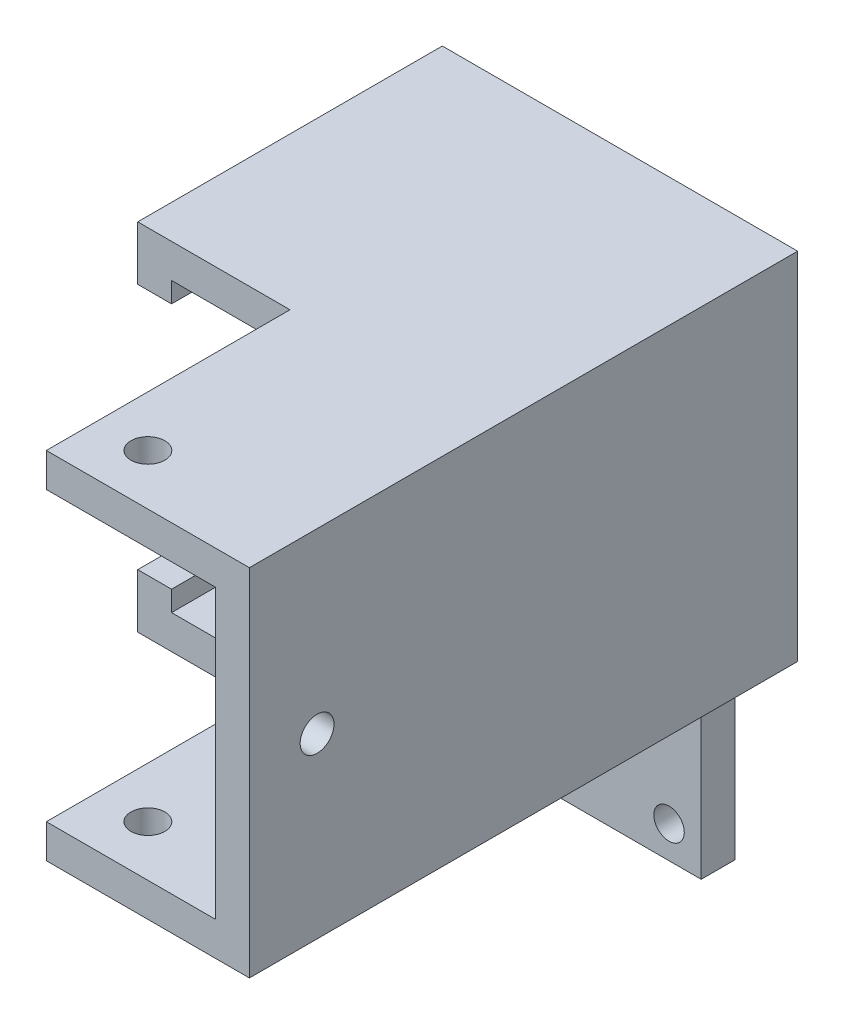
ISO-10303-21;
HEADER;
FILE_DESCRIPTION(('STEP AP214'),'2;1');
FILE_NAME('part.step','',(''),(''),'','','');
FILE_SCHEMA(('AUTOMOTIVE_DESIGN { 1 0 10303 214 1 1 1 1 }'));
ENDSEC;
DATA;
#1=APPLICATION_CONTEXT('core data for automotive mechanical design processes');
#2=APPLICATION_PROTOCOL_DEFINITION('international standard','automotive_design',2000,#1);
#3=PRODUCT_CONTEXT('',#1,'mechanical');
#4=PRODUCT('Part','Part','',(#3));
#5=PRODUCT_RELATED_PRODUCT_CATEGORY('part','',(#4));
#6=PRODUCT_DEFINITION_FORMATION('','',#4);
#7=PRODUCT_DEFINITION_CONTEXT('part definition',#1,'design');
#8=PRODUCT_DEFINITION('design','',#6,#7);
#9=PRODUCT_DEFINITION_SHAPE('','',#8);
#10=(LENGTH_UNIT() NAMED_UNIT(*) SI_UNIT(.MILLI.,.METRE.));
#11=(NAMED_UNIT(*) PLANE_ANGLE_UNIT() SI_UNIT($,.RADIAN.));
#12=(NAMED_UNIT(*) SI_UNIT($,.STERADIAN.) SOLID_ANGLE_UNIT());
#13=UNCERTAINTY_MEASURE_WITH_UNIT(LENGTH_MEASURE(1.E-05),#10,'distance_accuracy_value','');
#14=(GEOMETRIC_REPRESENTATION_CONTEXT(3) GLOBAL_UNCERTAINTY_ASSIGNED_CONTEXT((#13)) GLOBAL_UNIT_ASSIGNED_CONTEXT((#10,
#11,#12)) REPRESENTATION_CONTEXT('',''));
#15=CARTESIAN_POINT('',(0.,0.,0.));
#16=DIRECTION('',(0.,0.,1.));
#17=DIRECTION('',(1.,0.,0.));
#18=AXIS2_PLACEMENT_3D('',#15,#16,#17);
#19=CARTESIAN_POINT('',(0.,0.,45.));
#20=DIRECTION('',(0.,0.,1.));
#21=DIRECTION('',(1.,0.,0.));
#22=AXIS2_PLACEMENT_3D('',#19,#20,#21);
#23=PLANE('',#22);
#24=DIRECTION('',(-1.,0.,0.));
#25=VECTOR('',#24,1.);
#26=CARTESIAN_POINT('',(14.75,38.,45.));
#27=LINE('',#26,#25);
#28=CARTESIAN_POINT('',(-4.24999999999998,38.,45.));
#29=VERTEX_POINT('',#28);
#30=CARTESIAN_POINT('',(-9.24999999999999,38.,45.));
#31=VERTEX_POINT('',#30);
#32=EDGE_CURVE('E374',#29,#31,#27,.T.);
#33=ORIENTED_EDGE('',*,*,#32,.T.);
#34=DIRECTION('',(0.,-1.,0.));
#35=VECTOR('',#34,1.);
#36=CARTESIAN_POINT('',(-9.24999999999999,82.5,45.));
#37=LINE('',#36,#35);
#38=CARTESIAN_POINT('',(-9.24999999999999,30.,45.));
#39=VERTEX_POINT('',#38);
#40=EDGE_CURVE('E202',#31,#39,#37,.T.);
#41=ORIENTED_EDGE('',*,*,#40,.T.);
#42=DIRECTION('',(1.,0.,0.));
#43=VECTOR('',#42,1.);
#44=CARTESIAN_POINT('',(-9.24999999999999,30.,45.));
#45=LINE('',#44,#43);
#46=CARTESIAN_POINT('',(13.25,30.,45.));
#47=VERTEX_POINT('',#46);
#48=EDGE_CURVE('E201',#39,#47,#45,.T.);
#49=ORIENTED_EDGE('',*,*,#48,.T.);
#50=DIRECTION('',(0.,-1.,0.));
#51=VECTOR('',#50,1.);
#52=CARTESIAN_POINT('',(13.25,30.,45.));
#53=LINE('',#52,#51);
#54=CARTESIAN_POINT('',(13.25,35.,45.));
#55=VERTEX_POINT('',#54);
#56=EDGE_CURVE('E62',#55,#47,#53,.T.);
#57=ORIENTED_EDGE('',*,*,#56,.F.);
#58=DIRECTION('',(1.,0.,0.));
#59=VECTOR('',#58,1.);
#60=CARTESIAN_POINT('',(-4.24999999999998,35.,45.));
#61=LINE('',#60,#59);
#62=CARTESIAN_POINT('',(-4.24999999999998,35.,45.));
#63=VERTEX_POINT('',#62);
#64=EDGE_CURVE('E339',#63,#55,#61,.T.);
#65=ORIENTED_EDGE('',*,*,#64,.F.);
#66=DIRECTION('',(0.,-1.,0.));
#67=VECTOR('',#66,1.);
#68=CARTESIAN_POINT('',(-4.24999999999999,77.5,45.));
#69=LINE('',#68,#67);
#70=EDGE_CURVE('E340',#29,#63,#69,.T.);
#71=ORIENTED_EDGE('',*,*,#70,.F.);
#72=EDGE_LOOP('',(#33,#41,#49,#57,#65,#71));
#73=FACE_BOUND('',#72,.T.);
#74=ADVANCED_FACE('F37',(#73),#23,.T.);
#75=CARTESIAN_POINT('',(-4.24999999999999,77.5,45.));
#76=DIRECTION('',(1.,0.,0.));
#77=DIRECTION('',(0.,1.,0.));
#78=AXIS2_PLACEMENT_3D('',#75,#76,#77);
#79=PLANE('',#78);
#80=DIRECTION('',(0.,0.,-1.));
#81=VECTOR('',#80,1.);
#82=CARTESIAN_POINT('',(-4.24999999999998,38.,45.));
#83=LINE('',#82,#81);
#84=CARTESIAN_POINT('',(-4.24999999999999,38.,5.));
#85=VERTEX_POINT('',#84);
#86=EDGE_CURVE('E403',#29,#85,#83,.T.);
#87=ORIENTED_EDGE('',*,*,#86,.F.);
#88=ORIENTED_EDGE('',*,*,#70,.T.);
#89=DIRECTION('',(0.,0.,-1.));
#90=VECTOR('',#89,1.);
#91=CARTESIAN_POINT('',(-4.24999999999998,35.,45.));
#92=LINE('',#91,#90);
#93=CARTESIAN_POINT('',(-4.24999999999998,35.,5.));
#94=VERTEX_POINT('',#93);
#95=EDGE_CURVE('E205',#63,#94,#92,.T.);
#96=ORIENTED_EDGE('',*,*,#95,.T.);
#97=DIRECTION('',(0.,-1.,0.));
#98=VECTOR('',#97,1.);
#99=CARTESIAN_POINT('',(-4.24999999999999,77.5,5.));
#100=LINE('',#99,#98);
#101=EDGE_CURVE('E336',#85,#94,#100,.T.);
#102=ORIENTED_EDGE('',*,*,#101,.F.);
#103=EDGE_LOOP('',(#87,#88,#96,#102));
#104=FACE_BOUND('',#103,.T.);
#105=ADVANCED_FACE('F369',(#104),#79,.T.);
#106=CARTESIAN_POINT('',(0.,0.,5.));
#107=DIRECTION('',(0.,0.,1.));
#108=DIRECTION('',(1.,0.,0.));
#109=AXIS2_PLACEMENT_3D('',#106,#107,#108);
#110=PLANE('',#109);
#111=DIRECTION('',(1.,0.,0.));
#112=VECTOR('',#111,1.);
#113=CARTESIAN_POINT('',(-9.24999999999999,30.,5.));
#114=LINE('',#113,#112);
#115=CARTESIAN_POINT('',(0.,30.,5.));
#116=VERTEX_POINT('',#115);
#117=CARTESIAN_POINT('',(34.,30.,5.));
#118=VERTEX_POINT('',#117);
#119=EDGE_CURVE('E11',#116,#118,#114,.T.);
#120=ORIENTED_EDGE('',*,*,#119,.F.);
#121=DIRECTION('',(0.,-1.,0.));
#122=VECTOR('',#121,1.);
#123=CARTESIAN_POINT('',(0.,0.,5.));
#124=LINE('',#123,#122);
#125=CARTESIAN_POINT('',(0.,0.,5.));
#126=VERTEX_POINT('',#125);
#127=EDGE_CURVE('E235',#116,#126,#124,.T.);
#128=ORIENTED_EDGE('',*,*,#127,.T.);
#129=DIRECTION('',(1.,0.,0.));
#130=VECTOR('',#129,1.);
#131=CARTESIAN_POINT('',(0.,0.,5.));
#132=LINE('',#131,#130);
#133=CARTESIAN_POINT('',(34.,0.,5.));
#134=VERTEX_POINT('',#133);
#135=EDGE_CURVE('E238',#126,#134,#132,.T.);
#136=ORIENTED_EDGE('',*,*,#135,.T.);
#137=DIRECTION('',(0.,1.,0.));
#138=VECTOR('',#137,1.);
#139=CARTESIAN_POINT('',(34.,0.,5.));
#140=LINE('',#139,#138);
#141=EDGE_CURVE('E241',#134,#118,#140,.T.);
#142=ORIENTED_EDGE('',*,*,#141,.T.);
#143=EDGE_LOOP('',(#120,#128,#136,#142));
#144=FACE_BOUND('',#143,.T.);
#145=CARTESIAN_POINT('',(29.25,4.75,5.));
#146=DIRECTION('',(0.,0.,1.));
#147=DIRECTION('',(1.,0.,0.));
#148=AXIS2_PLACEMENT_3D('',#145,#146,#147);
#149=CIRCLE('',#148,2.25);
#150=CARTESIAN_POINT('',(31.5,4.75,5.));
#151=VERTEX_POINT('',#150);
#152=EDGE_CURVE('E217',#151,#151,#149,.T.);
#153=ORIENTED_EDGE('',*,*,#152,.F.);
#154=EDGE_LOOP('',(#153));
#155=FACE_BOUND('',#154,.T.);
#156=CARTESIAN_POINT('',(4.75,25.25,5.));
#157=DIRECTION('',(0.,0.,1.));
#158=DIRECTION('',(1.,0.,0.));
#159=AXIS2_PLACEMENT_3D('',#156,#157,#158);
#160=CIRCLE('',#159,2.25);
#161=CARTESIAN_POINT('',(7.,25.25,5.));
#162=VERTEX_POINT('',#161);
#163=EDGE_CURVE('E229',#162,#162,#160,.T.);
#164=ORIENTED_EDGE('',*,*,#163,.F.);
#165=EDGE_LOOP('',(#164));
#166=FACE_BOUND('',#165,.T.);
#167=CARTESIAN_POINT('',(29.25,25.25,5.));
#168=DIRECTION('',(0.,0.,1.));
#169=DIRECTION('',(1.,0.,0.));
#170=AXIS2_PLACEMENT_3D('',#167,#168,#169);
#171=CIRCLE('',#170,2.25000000000001);
#172=CARTESIAN_POINT('',(31.5,25.25,5.));
#173=VERTEX_POINT('',#172);
#174=EDGE_CURVE('E223',#173,#173,#171,.T.);
#175=ORIENTED_EDGE('',*,*,#174,.F.);
#176=EDGE_LOOP('',(#175));
#177=FACE_BOUND('',#176,.T.);
#178=CARTESIAN_POINT('',(4.75,4.75,5.));
#179=DIRECTION('',(0.,0.,1.));
#180=DIRECTION('',(1.,0.,0.));
#181=AXIS2_PLACEMENT_3D('',#178,#179,#180);
#182=CIRCLE('',#181,2.25);
#183=CARTESIAN_POINT('',(7.,4.75,5.));
#184=VERTEX_POINT('',#183);
#185=EDGE_CURVE('E211',#184,#184,#182,.T.);
#186=ORIENTED_EDGE('',*,*,#185,.F.);
#187=EDGE_LOOP('',(#186));
#188=FACE_BOUND('',#187,.T.);
#189=ADVANCED_FACE('F431',(#144,#155,#166,#177,#188),#110,.T.);
#190=CARTESIAN_POINT('',(0.,0.,0.));
#191=DIRECTION('',(0.,0.,1.));
#192=DIRECTION('',(1.,0.,0.));
#193=AXIS2_PLACEMENT_3D('',#190,#191,#192);
#194=PLANE('',#193);
#195=DIRECTION('',(0.,-1.,0.));
#196=VECTOR('',#195,1.);
#197=CARTESIAN_POINT('',(0.,0.,0.));
#198=LINE('',#197,#196);
#199=CARTESIAN_POINT('',(0.,30.,0.));
#200=VERTEX_POINT('',#199);
#201=CARTESIAN_POINT('',(0.,0.,0.));
#202=VERTEX_POINT('',#201);
#203=EDGE_CURVE('E232',#200,#202,#198,.T.);
#204=ORIENTED_EDGE('',*,*,#203,.F.);
#205=DIRECTION('',(1.,0.,0.));
#206=VECTOR('',#205,1.);
#207=CARTESIAN_POINT('',(0.,30.,0.));
#208=LINE('',#207,#206);
#209=CARTESIAN_POINT('',(-9.24999999999999,30.,0.));
#210=VERTEX_POINT('',#209);
#211=EDGE_CURVE('E239',#210,#200,#208,.T.);
#212=ORIENTED_EDGE('',*,*,#211,.F.);
#213=DIRECTION('',(0.,-1.,0.));
#214=VECTOR('',#213,1.);
#215=CARTESIAN_POINT('',(-9.24999999999999,30.,0.));
#216=LINE('',#215,#214);
#217=CARTESIAN_POINT('',(-9.24999999999999,82.5,0.));
#218=VERTEX_POINT('',#217);
#219=EDGE_CURVE('E256',#218,#210,#216,.T.);
#220=ORIENTED_EDGE('',*,*,#219,.F.);
#221=DIRECTION('',(-1.,0.,0.));
#222=VECTOR('',#221,1.);
#223=CARTESIAN_POINT('',(-9.24999999999999,82.5,0.));
#224=LINE('',#223,#222);
#225=CARTESIAN_POINT('',(43.25,82.5,0.));
#226=VERTEX_POINT('',#225);
#227=EDGE_CURVE('E254',#226,#218,#224,.T.);
#228=ORIENTED_EDGE('',*,*,#227,.F.);
#229=DIRECTION('',(0.,1.,0.));
#230=VECTOR('',#229,1.);
#231=CARTESIAN_POINT('',(43.25,82.5,0.));
#232=LINE('',#231,#230);
#233=CARTESIAN_POINT('',(43.25,30.,0.));
#234=VERTEX_POINT('',#233);
#235=EDGE_CURVE('E252',#234,#226,#232,.T.);
#236=ORIENTED_EDGE('',*,*,#235,.F.);
#237=DIRECTION('',(1.,0.,0.));
#238=VECTOR('',#237,1.);
#239=CARTESIAN_POINT('',(34.,30.,0.));
#240=LINE('',#239,#238);
#241=CARTESIAN_POINT('',(34.,30.,0.));
#242=VERTEX_POINT('',#241);
#243=EDGE_CURVE('E250',#242,#234,#240,.T.);
#244=ORIENTED_EDGE('',*,*,#243,.F.);
#245=DIRECTION('',(0.,1.,0.));
#246=VECTOR('',#245,1.);
#247=CARTESIAN_POINT('',(34.,0.,0.));
#248=LINE('',#247,#246);
#249=CARTESIAN_POINT('',(34.,0.,0.));
#250=VERTEX_POINT('',#249);
#251=EDGE_CURVE('E248',#250,#242,#248,.T.);
#252=ORIENTED_EDGE('',*,*,#251,.F.);
#253=DIRECTION('',(1.,0.,0.));
#254=VECTOR('',#253,1.);
#255=CARTESIAN_POINT('',(0.,0.,0.));
#256=LINE('',#255,#254);
#257=EDGE_CURVE('E246',#202,#250,#256,.T.);
#258=ORIENTED_EDGE('',*,*,#257,.F.);
#259=EDGE_LOOP('',(#204,#212,#220,#228,#236,#244,#252,#258));
#260=FACE_BOUND('',#259,.T.);
#261=CARTESIAN_POINT('',(4.75,25.25,0.));
#262=DIRECTION('',(0.,0.,1.));
#263=DIRECTION('',(1.,0.,0.));
#264=AXIS2_PLACEMENT_3D('',#261,#262,#263);
#265=CIRCLE('',#264,2.25);
#266=CARTESIAN_POINT('',(7.,25.25,0.));
#267=VERTEX_POINT('',#266);
#268=EDGE_CURVE('E226',#267,#267,#265,.T.);
#269=ORIENTED_EDGE('',*,*,#268,.T.);
#270=EDGE_LOOP('',(#269));
#271=FACE_BOUND('',#270,.T.);
#272=CARTESIAN_POINT('',(29.25,25.25,0.));
#273=DIRECTION('',(0.,0.,1.));
#274=DIRECTION('',(1.,0.,0.));
#275=AXIS2_PLACEMENT_3D('',#272,#273,#274);
#276=CIRCLE('',#275,2.25000000000001);
#277=CARTESIAN_POINT('',(31.5,25.25,0.));
#278=VERTEX_POINT('',#277);
#279=EDGE_CURVE('E220',#278,#278,#276,.T.);
#280=ORIENTED_EDGE('',*,*,#279,.T.);
#281=EDGE_LOOP('',(#280));
#282=FACE_BOUND('',#281,.T.);
#283=CARTESIAN_POINT('',(29.25,4.75,0.));
#284=DIRECTION('',(0.,0.,1.));
#285=DIRECTION('',(1.,0.,0.));
#286=AXIS2_PLACEMENT_3D('',#283,#284,#285);
#287=CIRCLE('',#286,2.25);
#288=CARTESIAN_POINT('',(31.5,4.75,0.));
#289=VERTEX_POINT('',#288);
#290=EDGE_CURVE('E214',#289,#289,#287,.T.);
#291=ORIENTED_EDGE('',*,*,#290,.T.);
#292=EDGE_LOOP('',(#291));
#293=FACE_BOUND('',#292,.T.);
#294=CARTESIAN_POINT('',(4.75,4.75,0.));
#295=DIRECTION('',(0.,0.,1.));
#296=DIRECTION('',(1.,0.,0.));
#297=AXIS2_PLACEMENT_3D('',#294,#295,#296);
#298=CIRCLE('',#297,2.25);
#299=CARTESIAN_POINT('',(7.,4.75,0.));
#300=VERTEX_POINT('',#299);
#301=EDGE_CURVE('E209',#300,#300,#298,.T.);
#302=ORIENTED_EDGE('',*,*,#301,.T.);
#303=EDGE_LOOP('',(#302));
#304=FACE_BOUND('',#303,.T.);
#305=ADVANCED_FACE('F424',(#260,#271,#282,#293,#304),#194,.F.);
#306=CARTESIAN_POINT('',(0.,0.,5.));
#307=DIRECTION('',(1.,0.,0.));
#308=DIRECTION('',(0.,1.,0.));
#309=AXIS2_PLACEMENT_3D('',#306,#307,#308);
#310=PLANE('',#309);
#311=ORIENTED_EDGE('',*,*,#203,.T.);
#312=DIRECTION('',(0.,0.,-1.));
#313=VECTOR('',#312,1.);
#314=CARTESIAN_POINT('',(0.,0.,5.));
#315=LINE('',#314,#313);
#316=EDGE_CURVE('E46',#126,#202,#315,.T.);
#317=ORIENTED_EDGE('',*,*,#316,.F.);
#318=ORIENTED_EDGE('',*,*,#127,.F.);
#319=DIRECTION('',(0.,0.,-1.));
#320=VECTOR('',#319,1.);
#321=CARTESIAN_POINT('',(0.,30.,5.));
#322=LINE('',#321,#320);
#323=EDGE_CURVE('E243',#116,#200,#322,.T.);
#324=ORIENTED_EDGE('',*,*,#323,.T.);
#325=EDGE_LOOP('',(#311,#317,#318,#324));
#326=FACE_BOUND('',#325,.T.);
#327=ADVANCED_FACE('F39',(#326),#310,.F.);
#328=CARTESIAN_POINT('',(0.,0.,5.));
#329=DIRECTION('',(0.,1.,0.));
#330=DIRECTION('',(0.,0.,1.));
#331=AXIS2_PLACEMENT_3D('',#328,#329,#330);
#332=PLANE('',#331);
#333=ORIENTED_EDGE('',*,*,#257,.T.);
#334=DIRECTION('',(0.,0.,-1.));
#335=VECTOR('',#334,1.);
#336=CARTESIAN_POINT('',(34.,0.,5.));
#337=LINE('',#336,#335);
#338=EDGE_CURVE('E275',#134,#250,#337,.T.);
#339=ORIENTED_EDGE('',*,*,#338,.F.);
#340=ORIENTED_EDGE('',*,*,#135,.F.);
#341=ORIENTED_EDGE('',*,*,#316,.T.);
#342=EDGE_LOOP('',(#333,#339,#340,#341));
#343=FACE_BOUND('',#342,.T.);
#344=ADVANCED_FACE('F439',(#343),#332,.F.);
#345=CARTESIAN_POINT('',(34.,0.,5.));
#346=DIRECTION('',(-1.,0.,0.));
#347=DIRECTION('',(0.,-1.,0.));
#348=AXIS2_PLACEMENT_3D('',#345,#346,#347);
#349=PLANE('',#348);
#350=ORIENTED_EDGE('',*,*,#251,.T.);
#351=DIRECTION('',(0.,0.,-1.));
#352=VECTOR('',#351,1.);
#353=CARTESIAN_POINT('',(34.,30.,5.));
#354=LINE('',#353,#352);
#355=EDGE_CURVE('E272',#118,#242,#354,.T.);
#356=ORIENTED_EDGE('',*,*,#355,.F.);
#357=ORIENTED_EDGE('',*,*,#141,.F.);
#358=ORIENTED_EDGE('',*,*,#338,.T.);
#359=EDGE_LOOP('',(#350,#356,#357,#358));
#360=FACE_BOUND('',#359,.T.);
#361=ADVANCED_FACE('F413',(#360),#349,.F.);
#362=CARTESIAN_POINT('',(43.25,82.5,5.));
#363=DIRECTION('',(-1.,0.,0.));
#364=DIRECTION('',(0.,-1.,0.));
#365=AXIS2_PLACEMENT_3D('',#362,#363,#364);
#366=PLANE('',#365);
#367=CARTESIAN_POINT('',(43.25,56.25,71.));
#368=DIRECTION('',(1.,0.,0.));
#369=DIRECTION('',(0.,1.,0.));
#370=AXIS2_PLACEMENT_3D('',#367,#368,#369);
#371=CIRCLE('',#370,2.50000000000001);
#372=CARTESIAN_POINT('',(43.25,58.75,71.));
#373=VERTEX_POINT('',#372);
#374=EDGE_CURVE('E293',#373,#373,#371,.T.);
#375=ORIENTED_EDGE('',*,*,#374,.F.);
#376=EDGE_LOOP('',(#375));
#377=FACE_BOUND('',#376,.T.);
#378=ORIENTED_EDGE('',*,*,#235,.T.);
#379=DIRECTION('',(0.,0.,-1.));
#380=VECTOR('',#379,1.);
#381=CARTESIAN_POINT('',(43.25,82.5,5.));
#382=LINE('',#381,#380);
#383=CARTESIAN_POINT('',(43.25,82.5,81.));
#384=VERTEX_POINT('',#383);
#385=EDGE_CURVE('E266',#384,#226,#382,.T.);
#386=ORIENTED_EDGE('',*,*,#385,.F.);
#387=DIRECTION('',(0.,1.,0.));
#388=VECTOR('',#387,1.);
#389=CARTESIAN_POINT('',(43.25,82.5,81.));
#390=LINE('',#389,#388);
#391=CARTESIAN_POINT('',(43.25,30.,81.));
#392=VERTEX_POINT('',#391);
#393=EDGE_CURVE('E318',#392,#384,#390,.T.);
#394=ORIENTED_EDGE('',*,*,#393,.F.);
#395=DIRECTION('',(0.,0.,-1.));
#396=VECTOR('',#395,1.);
#397=CARTESIAN_POINT('',(43.25,30.,5.));
#398=LINE('',#397,#396);
#399=EDGE_CURVE('E269',#392,#234,#398,.T.);
#400=ORIENTED_EDGE('',*,*,#399,.T.);
#401=EDGE_LOOP('',(#378,#386,#394,#400));
#402=FACE_BOUND('',#401,.T.);
#403=ADVANCED_FACE('F409',(#377,#402),#366,.F.);
#404=CARTESIAN_POINT('',(-9.24999999999999,82.5,5.));
#405=DIRECTION('',(0.,-1.,0.));
#406=DIRECTION('',(0.,0.,-1.));
#407=AXIS2_PLACEMENT_3D('',#404,#405,#406);
#408=PLANE('',#407);
#409=CARTESIAN_POINT('',(20.75,82.5,73.5));
#410=DIRECTION('',(0.,-1.,0.));
#411=DIRECTION('',(0.,0.,-1.));
#412=AXIS2_PLACEMENT_3D('',#409,#410,#411);
#413=CIRCLE('',#412,2.5);
#414=CARTESIAN_POINT('',(20.75,82.5,71.));
#415=VERTEX_POINT('',#414);
#416=EDGE_CURVE('E282',#415,#415,#413,.T.);
#417=ORIENTED_EDGE('',*,*,#416,.T.);
#418=EDGE_LOOP('',(#417));
#419=FACE_BOUND('',#418,.T.);
#420=ORIENTED_EDGE('',*,*,#227,.T.);
#421=DIRECTION('',(0.,0.,-1.));
#422=VECTOR('',#421,1.);
#423=CARTESIAN_POINT('',(-9.24999999999999,82.5,5.));
#424=LINE('',#423,#422);
#425=CARTESIAN_POINT('',(-9.24999999999999,82.5,45.));
#426=VERTEX_POINT('',#425);
#427=EDGE_CURVE('E264',#426,#218,#424,.T.);
#428=ORIENTED_EDGE('',*,*,#427,.F.);
#429=DIRECTION('',(-1.,0.,0.));
#430=VECTOR('',#429,1.);
#431=CARTESIAN_POINT('',(-9.24999999999999,82.5,45.));
#432=LINE('',#431,#430);
#433=CARTESIAN_POINT('',(13.25,82.5,45.));
#434=VERTEX_POINT('',#433);
#435=EDGE_CURVE('E199',#434,#426,#432,.T.);
#436=ORIENTED_EDGE('',*,*,#435,.F.);
#437=DIRECTION('',(0.,0.,-1.));
#438=VECTOR('',#437,1.);
#439=CARTESIAN_POINT('',(13.25,82.5,81.));
#440=LINE('',#439,#438);
#441=CARTESIAN_POINT('',(13.25,82.5,81.));
#442=VERTEX_POINT('',#441);
#443=EDGE_CURVE('E333',#442,#434,#440,.T.);
#444=ORIENTED_EDGE('',*,*,#443,.F.);
#445=DIRECTION('',(-1.,0.,0.));
#446=VECTOR('',#445,1.);
#447=CARTESIAN_POINT('',(13.25,82.5,81.));
#448=LINE('',#447,#446);
#449=EDGE_CURVE('E300',#384,#442,#448,.T.);
#450=ORIENTED_EDGE('',*,*,#449,.F.);
#451=ORIENTED_EDGE('',*,*,#385,.T.);
#452=EDGE_LOOP('',(#420,#428,#436,#444,#450,#451));
#453=FACE_BOUND('',#452,.T.);
#454=ADVANCED_FACE('F412',(#419,#453),#408,.F.);
#455=CARTESIAN_POINT('',(-9.24999999999999,30.,5.));
#456=DIRECTION('',(1.,0.,0.));
#457=DIRECTION('',(0.,1.,0.));
#458=AXIS2_PLACEMENT_3D('',#455,#456,#457);
#459=PLANE('',#458);
#460=ORIENTED_EDGE('',*,*,#40,.F.);
#461=DIRECTION('',(0.,0.,1.));
#462=VECTOR('',#461,1.);
#463=CARTESIAN_POINT('',(-9.24999999999999,38.,45.));
#464=LINE('',#463,#462);
#465=CARTESIAN_POINT('',(-9.24999999999999,38.,5.));
#466=VERTEX_POINT('',#465);
#467=EDGE_CURVE('E185',#466,#31,#464,.T.);
#468=ORIENTED_EDGE('',*,*,#467,.F.);
#469=DIRECTION('',(0.,-1.,0.));
#470=VECTOR('',#469,1.);
#471=CARTESIAN_POINT('',(-9.24999999999999,74.5,5.));
#472=LINE('',#471,#470);
#473=CARTESIAN_POINT('',(-9.24999999999999,74.5,5.));
#474=VERTEX_POINT('',#473);
#475=EDGE_CURVE('E195',#474,#466,#472,.T.);
#476=ORIENTED_EDGE('',*,*,#475,.F.);
#477=DIRECTION('',(0.,0.,-1.));
#478=VECTOR('',#477,1.);
#479=CARTESIAN_POINT('',(-9.24999999999999,74.5,45.));
#480=LINE('',#479,#478);
#481=CARTESIAN_POINT('',(-9.24999999999999,74.5,45.));
#482=VERTEX_POINT('',#481);
#483=EDGE_CURVE('E178',#482,#474,#480,.T.);
#484=ORIENTED_EDGE('',*,*,#483,.F.);
#485=EDGE_CURVE('E192',#426,#482,#37,.T.);
#486=ORIENTED_EDGE('',*,*,#485,.F.);
#487=ORIENTED_EDGE('',*,*,#427,.T.);
#488=ORIENTED_EDGE('',*,*,#219,.T.);
#489=DIRECTION('',(0.,0.,-1.));
#490=VECTOR('',#489,1.);
#491=CARTESIAN_POINT('',(-9.24999999999999,30.,5.));
#492=LINE('',#491,#490);
#493=EDGE_CURVE('E261',#39,#210,#492,.T.);
#494=ORIENTED_EDGE('',*,*,#493,.F.);
#495=EDGE_LOOP('',(#460,#468,#476,#484,#486,#487,#488,#494));
#496=FACE_BOUND('',#495,.T.);
#497=ADVANCED_FACE('F190',(#496),#459,.F.);
#498=CARTESIAN_POINT('',(0.,30.,5.));
#499=DIRECTION('',(0.,1.,0.));
#500=DIRECTION('',(0.,0.,1.));
#501=AXIS2_PLACEMENT_3D('',#498,#499,#500);
#502=PLANE('',#501);
#503=CARTESIAN_POINT('',(20.75,30.,73.5));
#504=DIRECTION('',(0.,1.,0.));
#505=DIRECTION('',(0.,0.,1.));
#506=AXIS2_PLACEMENT_3D('',#503,#504,#505);
#507=CIRCLE('',#506,2.5);
#508=CARTESIAN_POINT('',(20.75,30.,76.));
#509=VERTEX_POINT('',#508);
#510=EDGE_CURVE('E286',#509,#509,#507,.T.);
#511=ORIENTED_EDGE('',*,*,#510,.T.);
#512=EDGE_LOOP('',(#511));
#513=FACE_BOUND('',#512,.T.);
#514=ORIENTED_EDGE('',*,*,#211,.T.);
#515=ORIENTED_EDGE('',*,*,#323,.F.);
#516=ORIENTED_EDGE('',*,*,#119,.T.);
#517=ORIENTED_EDGE('',*,*,#355,.T.);
#518=ORIENTED_EDGE('',*,*,#243,.T.);
#519=ORIENTED_EDGE('',*,*,#399,.F.);
#520=DIRECTION('',(1.,0.,0.));
#521=VECTOR('',#520,1.);
#522=CARTESIAN_POINT('',(43.25,30.,81.));
#523=LINE('',#522,#521);
#524=CARTESIAN_POINT('',(13.25,30.,81.));
#525=VERTEX_POINT('',#524);
#526=EDGE_CURVE('E315',#525,#392,#523,.T.);
#527=ORIENTED_EDGE('',*,*,#526,.F.);
#528=DIRECTION('',(0.,0.,-1.));
#529=VECTOR('',#528,1.);
#530=CARTESIAN_POINT('',(13.25,30.,81.));
#531=LINE('',#530,#529);
#532=EDGE_CURVE('E321',#525,#47,#531,.T.);
#533=ORIENTED_EDGE('',*,*,#532,.T.);
#534=ORIENTED_EDGE('',*,*,#48,.F.);
#535=ORIENTED_EDGE('',*,*,#493,.T.);
#536=EDGE_LOOP('',(#514,#515,#516,#517,#518,#519,#527,#533,#534,#535));
#537=FACE_BOUND('',#536,.T.);
#538=ADVANCED_FACE('F383',(#513,#537),#502,.F.);
#539=CARTESIAN_POINT('',(4.75,25.25,5.));
#540=DIRECTION('',(0.,0.,-1.));
#541=DIRECTION('',(-1.,0.,0.));
#542=AXIS2_PLACEMENT_3D('',#539,#540,#541);
#543=CYLINDRICAL_SURFACE('',#542,2.25);
#544=ORIENTED_EDGE('',*,*,#163,.T.);
#545=EDGE_LOOP('',(#544));
#546=FACE_BOUND('',#545,.T.);
#547=ORIENTED_EDGE('',*,*,#268,.F.);
#548=EDGE_LOOP('',(#547));
#549=FACE_BOUND('',#548,.T.);
#550=ADVANCED_FACE('F473',(#546,#549),#543,.F.);
#551=CARTESIAN_POINT('',(29.25,25.25,5.));
#552=DIRECTION('',(0.,0.,-1.));
#553=DIRECTION('',(-1.,0.,0.));
#554=AXIS2_PLACEMENT_3D('',#551,#552,#553);
#555=CYLINDRICAL_SURFACE('',#554,2.25000000000001);
#556=ORIENTED_EDGE('',*,*,#174,.T.);
#557=EDGE_LOOP('',(#556));
#558=FACE_BOUND('',#557,.T.);
#559=ORIENTED_EDGE('',*,*,#279,.F.);
#560=EDGE_LOOP('',(#559));
#561=FACE_BOUND('',#560,.T.);
#562=ADVANCED_FACE('F466',(#558,#561),#555,.F.);
#563=CARTESIAN_POINT('',(29.25,4.75,5.));
#564=DIRECTION('',(0.,0.,-1.));
#565=DIRECTION('',(-1.,0.,0.));
#566=AXIS2_PLACEMENT_3D('',#563,#564,#565);
#567=CYLINDRICAL_SURFACE('',#566,2.25);
#568=ORIENTED_EDGE('',*,*,#152,.T.);
#569=EDGE_LOOP('',(#568));
#570=FACE_BOUND('',#569,.T.);
#571=ORIENTED_EDGE('',*,*,#290,.F.);
#572=EDGE_LOOP('',(#571));
#573=FACE_BOUND('',#572,.T.);
#574=ADVANCED_FACE('F461',(#570,#573),#567,.F.);
#575=CARTESIAN_POINT('',(4.75,4.75,5.));
#576=DIRECTION('',(0.,0.,-1.));
#577=DIRECTION('',(-1.,0.,0.));
#578=AXIS2_PLACEMENT_3D('',#575,#576,#577);
#579=CYLINDRICAL_SURFACE('',#578,2.25);
#580=ORIENTED_EDGE('',*,*,#185,.T.);
#581=EDGE_LOOP('',(#580));
#582=FACE_BOUND('',#581,.T.);
#583=ORIENTED_EDGE('',*,*,#301,.F.);
#584=EDGE_LOOP('',(#583));
#585=FACE_BOUND('',#584,.T.);
#586=ADVANCED_FACE('F455',(#582,#585),#579,.F.);
#587=DIRECTION('',(-1.,0.,0.));
#588=VECTOR('',#587,1.);
#589=CARTESIAN_POINT('',(14.75,74.5,45.));
#590=LINE('',#589,#588);
#591=CARTESIAN_POINT('',(-4.24999999999999,74.5,45.));
#592=VERTEX_POINT('',#591);
#593=EDGE_CURVE('E175',#592,#482,#590,.T.);
#594=ORIENTED_EDGE('',*,*,#593,.F.);
#595=CARTESIAN_POINT('',(-4.24999999999999,77.5,45.));
#596=VERTEX_POINT('',#595);
#597=EDGE_CURVE('E337',#596,#592,#69,.T.);
#598=ORIENTED_EDGE('',*,*,#597,.F.);
#599=DIRECTION('',(-1.,0.,0.));
#600=VECTOR('',#599,1.);
#601=CARTESIAN_POINT('',(-4.24999999999999,77.5,45.));
#602=LINE('',#601,#600);
#603=CARTESIAN_POINT('',(13.25,77.5,45.));
#604=VERTEX_POINT('',#603);
#605=EDGE_CURVE('E342',#604,#596,#602,.T.);
#606=ORIENTED_EDGE('',*,*,#605,.F.);
#607=DIRECTION('',(0.,-1.,0.));
#608=VECTOR('',#607,1.);
#609=CARTESIAN_POINT('',(13.25,82.5,45.));
#610=LINE('',#609,#608);
#611=EDGE_CURVE('E299',#434,#604,#610,.T.);
#612=ORIENTED_EDGE('',*,*,#611,.F.);
#613=ORIENTED_EDGE('',*,*,#435,.T.);
#614=ORIENTED_EDGE('',*,*,#485,.T.);
#615=EDGE_LOOP('',(#594,#598,#606,#612,#613,#614));
#616=FACE_BOUND('',#615,.T.);
#617=ADVANCED_FACE('F197',(#616),#23,.T.);
#618=DIRECTION('',(0.,0.,1.));
#619=VECTOR('',#618,1.);
#620=CARTESIAN_POINT('',(-4.24999999999999,74.5,45.));
#621=LINE('',#620,#619);
#622=CARTESIAN_POINT('',(-4.24999999999999,74.5,5.));
#623=VERTEX_POINT('',#622);
#624=EDGE_CURVE('E180',#623,#592,#621,.T.);
#625=ORIENTED_EDGE('',*,*,#624,.F.);
#626=CARTESIAN_POINT('',(-4.24999999999999,77.5,5.));
#627=VERTEX_POINT('',#626);
#628=EDGE_CURVE('E345',#627,#623,#100,.T.);
#629=ORIENTED_EDGE('',*,*,#628,.F.);
#630=DIRECTION('',(0.,0.,-1.));
#631=VECTOR('',#630,1.);
#632=CARTESIAN_POINT('',(-4.24999999999999,77.5,45.));
#633=LINE('',#632,#631);
#634=EDGE_CURVE('E344',#596,#627,#633,.T.);
#635=ORIENTED_EDGE('',*,*,#634,.F.);
#636=ORIENTED_EDGE('',*,*,#597,.T.);
#637=EDGE_LOOP('',(#625,#629,#635,#636));
#638=FACE_BOUND('',#637,.T.);
#639=ADVANCED_FACE('F452',(#638),#79,.T.);
#640=CARTESIAN_POINT('',(-4.24999999999998,35.,45.));
#641=DIRECTION('',(0.,1.,0.));
#642=DIRECTION('',(0.,0.,1.));
#643=AXIS2_PLACEMENT_3D('',#640,#641,#642);
#644=PLANE('',#643);
#645=CARTESIAN_POINT('',(20.75,35.,73.5));
#646=DIRECTION('',(0.,1.,0.));
#647=DIRECTION('',(0.,0.,1.));
#648=AXIS2_PLACEMENT_3D('',#645,#646,#647);
#649=CIRCLE('',#648,2.5);
#650=CARTESIAN_POINT('',(20.75,35.,76.));
#651=VERTEX_POINT('',#650);
#652=EDGE_CURVE('E281',#651,#651,#649,.T.);
#653=ORIENTED_EDGE('',*,*,#652,.F.);
#654=EDGE_LOOP('',(#653));
#655=FACE_BOUND('',#654,.T.);
#656=DIRECTION('',(1.,0.,0.));
#657=VECTOR('',#656,1.);
#658=CARTESIAN_POINT('',(-4.24999999999998,35.,5.));
#659=LINE('',#658,#657);
#660=CARTESIAN_POINT('',(38.25,35.,5.));
#661=VERTEX_POINT('',#660);
#662=EDGE_CURVE('E348',#94,#661,#659,.T.);
#663=ORIENTED_EDGE('',*,*,#662,.F.);
#664=ORIENTED_EDGE('',*,*,#95,.F.);
#665=ORIENTED_EDGE('',*,*,#64,.T.);
#666=DIRECTION('',(0.,0.,-1.));
#667=VECTOR('',#666,1.);
#668=CARTESIAN_POINT('',(13.25,35.,81.));
#669=LINE('',#668,#667);
#670=CARTESIAN_POINT('',(13.25,35.,81.));
#671=VERTEX_POINT('',#670);
#672=EDGE_CURVE('E327',#671,#55,#669,.T.);
#673=ORIENTED_EDGE('',*,*,#672,.F.);
#674=DIRECTION('',(-1.,0.,0.));
#675=VECTOR('',#674,1.);
#676=CARTESIAN_POINT('',(13.25,35.,81.));
#677=LINE('',#676,#675);
#678=CARTESIAN_POINT('',(38.25,35.,81.));
#679=VERTEX_POINT('',#678);
#680=EDGE_CURVE('E311',#679,#671,#677,.T.);
#681=ORIENTED_EDGE('',*,*,#680,.F.);
#682=DIRECTION('',(0.,0.,-1.));
#683=VECTOR('',#682,1.);
#684=CARTESIAN_POINT('',(38.25,35.,45.));
#685=LINE('',#684,#683);
#686=EDGE_CURVE('E359',#679,#661,#685,.T.);
#687=ORIENTED_EDGE('',*,*,#686,.T.);
#688=EDGE_LOOP('',(#663,#664,#665,#673,#681,#687));
#689=FACE_BOUND('',#688,.T.);
#690=ADVANCED_FACE('F371',(#655,#689),#644,.T.);
#691=CARTESIAN_POINT('',(38.25,77.5,45.));
#692=DIRECTION('',(-1.,0.,0.));
#693=DIRECTION('',(0.,-1.,0.));
#694=AXIS2_PLACEMENT_3D('',#691,#692,#693);
#695=PLANE('',#694);
#696=CARTESIAN_POINT('',(38.25,56.25,71.));
#697=DIRECTION('',(-1.,0.,0.));
#698=DIRECTION('',(0.,-1.,0.));
#699=AXIS2_PLACEMENT_3D('',#696,#697,#698);
#700=CIRCLE('',#699,2.50000000000001);
#701=CARTESIAN_POINT('',(38.25,53.75,71.));
#702=VERTEX_POINT('',#701);
#703=EDGE_CURVE('E41',#702,#702,#700,.T.);
#704=ORIENTED_EDGE('',*,*,#703,.F.);
#705=EDGE_LOOP('',(#704));
#706=FACE_BOUND('',#705,.T.);
#707=DIRECTION('',(0.,1.,0.));
#708=VECTOR('',#707,1.);
#709=CARTESIAN_POINT('',(38.25,77.5,5.));
#710=LINE('',#709,#708);
#711=CARTESIAN_POINT('',(38.25,77.5,5.));
#712=VERTEX_POINT('',#711);
#713=EDGE_CURVE('E351',#661,#712,#710,.T.);
#714=ORIENTED_EDGE('',*,*,#713,.F.);
#715=ORIENTED_EDGE('',*,*,#686,.F.);
#716=DIRECTION('',(0.,-1.,0.));
#717=VECTOR('',#716,1.);
#718=CARTESIAN_POINT('',(38.25,77.5,81.));
#719=LINE('',#718,#717);
#720=CARTESIAN_POINT('',(38.25,77.5,81.));
#721=VERTEX_POINT('',#720);
#722=EDGE_CURVE('E308',#721,#679,#719,.T.);
#723=ORIENTED_EDGE('',*,*,#722,.F.);
#724=DIRECTION('',(0.,0.,-1.));
#725=VECTOR('',#724,1.);
#726=CARTESIAN_POINT('',(38.25,77.5,45.));
#727=LINE('',#726,#725);
#728=EDGE_CURVE('E358',#721,#712,#727,.T.);
#729=ORIENTED_EDGE('',*,*,#728,.T.);
#730=EDGE_LOOP('',(#714,#715,#723,#729));
#731=FACE_BOUND('',#730,.T.);
#732=ADVANCED_FACE('F394',(#706,#731),#695,.T.);
#733=CARTESIAN_POINT('',(-4.24999999999999,77.5,45.));
#734=DIRECTION('',(0.,-1.,0.));
#735=DIRECTION('',(0.,0.,-1.));
#736=AXIS2_PLACEMENT_3D('',#733,#734,#735);
#737=PLANE('',#736);
#738=CARTESIAN_POINT('',(20.75,77.5,73.5));
#739=DIRECTION('',(0.,-1.,0.));
#740=DIRECTION('',(0.,0.,-1.));
#741=AXIS2_PLACEMENT_3D('',#738,#739,#740);
#742=CIRCLE('',#741,2.5);
#743=CARTESIAN_POINT('',(20.75,77.5,71.));
#744=VERTEX_POINT('',#743);
#745=EDGE_CURVE('E279',#744,#744,#742,.T.);
#746=ORIENTED_EDGE('',*,*,#745,.F.);
#747=EDGE_LOOP('',(#746));
#748=FACE_BOUND('',#747,.T.);
#749=DIRECTION('',(-1.,0.,0.));
#750=VECTOR('',#749,1.);
#751=CARTESIAN_POINT('',(-4.24999999999999,77.5,5.));
#752=LINE('',#751,#750);
#753=EDGE_CURVE('E354',#712,#627,#752,.T.);
#754=ORIENTED_EDGE('',*,*,#753,.F.);
#755=ORIENTED_EDGE('',*,*,#728,.F.);
#756=DIRECTION('',(1.,0.,0.));
#757=VECTOR('',#756,1.);
#758=CARTESIAN_POINT('',(13.25,77.5,81.));
#759=LINE('',#758,#757);
#760=CARTESIAN_POINT('',(13.25,77.5,81.));
#761=VERTEX_POINT('',#760);
#762=EDGE_CURVE('E305',#761,#721,#759,.T.);
#763=ORIENTED_EDGE('',*,*,#762,.F.);
#764=DIRECTION('',(0.,0.,-1.));
#765=VECTOR('',#764,1.);
#766=CARTESIAN_POINT('',(13.25,77.5,81.));
#767=LINE('',#766,#765);
#768=EDGE_CURVE('E330',#761,#604,#767,.T.);
#769=ORIENTED_EDGE('',*,*,#768,.T.);
#770=ORIENTED_EDGE('',*,*,#605,.T.);
#771=ORIENTED_EDGE('',*,*,#634,.T.);
#772=EDGE_LOOP('',(#754,#755,#763,#769,#770,#771));
#773=FACE_BOUND('',#772,.T.);
#774=ADVANCED_FACE('F631',(#748,#773),#737,.T.);
#775=ORIENTED_EDGE('',*,*,#628,.T.);
#776=DIRECTION('',(-1.,0.,0.));
#777=VECTOR('',#776,1.);
#778=CARTESIAN_POINT('',(14.75,74.5,5.));
#779=LINE('',#778,#777);
#780=EDGE_CURVE('E54',#623,#474,#779,.T.);
#781=ORIENTED_EDGE('',*,*,#780,.T.);
#782=ORIENTED_EDGE('',*,*,#475,.T.);
#783=DIRECTION('',(-1.,0.,0.));
#784=VECTOR('',#783,1.);
#785=CARTESIAN_POINT('',(14.75,38.,5.));
#786=LINE('',#785,#784);
#787=EDGE_CURVE('E377',#85,#466,#786,.T.);
#788=ORIENTED_EDGE('',*,*,#787,.F.);
#789=ORIENTED_EDGE('',*,*,#101,.T.);
#790=ORIENTED_EDGE('',*,*,#662,.T.);
#791=ORIENTED_EDGE('',*,*,#713,.T.);
#792=ORIENTED_EDGE('',*,*,#753,.T.);
#793=EDGE_LOOP('',(#775,#781,#782,#788,#789,#790,#791,#792));
#794=FACE_BOUND('',#793,.T.);
#795=ADVANCED_FACE('F397',(#794),#110,.T.);
#796=CARTESIAN_POINT('',(13.25,82.5,81.));
#797=DIRECTION('',(1.,0.,0.));
#798=DIRECTION('',(0.,0.,-1.));
#799=AXIS2_PLACEMENT_3D('',#796,#797,#798);
#800=PLANE('',#799);
#801=ORIENTED_EDGE('',*,*,#611,.T.);
#802=ORIENTED_EDGE('',*,*,#768,.F.);
#803=DIRECTION('',(0.,-1.,0.));
#804=VECTOR('',#803,1.);
#805=CARTESIAN_POINT('',(13.25,82.5,81.));
#806=LINE('',#805,#804);
#807=EDGE_CURVE('E303',#442,#761,#806,.T.);
#808=ORIENTED_EDGE('',*,*,#807,.F.);
#809=ORIENTED_EDGE('',*,*,#443,.T.);
#810=EDGE_LOOP('',(#801,#802,#808,#809));
#811=FACE_BOUND('',#810,.T.);
#812=ADVANCED_FACE('F551',(#811),#800,.F.);
#813=CARTESIAN_POINT('',(13.25,30.,81.));
#814=DIRECTION('',(1.,0.,0.));
#815=DIRECTION('',(0.,1.,0.));
#816=AXIS2_PLACEMENT_3D('',#813,#814,#815);
#817=PLANE('',#816);
#818=ORIENTED_EDGE('',*,*,#56,.T.);
#819=ORIENTED_EDGE('',*,*,#532,.F.);
#820=DIRECTION('',(0.,-1.,0.));
#821=VECTOR('',#820,1.);
#822=CARTESIAN_POINT('',(13.25,30.,81.));
#823=LINE('',#822,#821);
#824=EDGE_CURVE('E313',#671,#525,#823,.T.);
#825=ORIENTED_EDGE('',*,*,#824,.F.);
#826=ORIENTED_EDGE('',*,*,#672,.T.);
#827=EDGE_LOOP('',(#818,#819,#825,#826));
#828=FACE_BOUND('',#827,.T.);
#829=ADVANCED_FACE('F387',(#828),#817,.F.);
#830=CARTESIAN_POINT('',(0.,0.,81.));
#831=DIRECTION('',(0.,0.,-1.));
#832=DIRECTION('',(-1.,0.,0.));
#833=AXIS2_PLACEMENT_3D('',#830,#831,#832);
#834=PLANE('',#833);
#835=ORIENTED_EDGE('',*,*,#449,.T.);
#836=ORIENTED_EDGE('',*,*,#807,.T.);
#837=ORIENTED_EDGE('',*,*,#762,.T.);
#838=ORIENTED_EDGE('',*,*,#722,.T.);
#839=ORIENTED_EDGE('',*,*,#680,.T.);
#840=ORIENTED_EDGE('',*,*,#824,.T.);
#841=ORIENTED_EDGE('',*,*,#526,.T.);
#842=ORIENTED_EDGE('',*,*,#393,.T.);
#843=EDGE_LOOP('',(#835,#836,#837,#838,#839,#840,#841,#842));
#844=FACE_BOUND('',#843,.T.);
#845=ADVANCED_FACE('F390',(#844),#834,.F.);
#846=CARTESIAN_POINT('',(20.75,82.5,73.5));
#847=DIRECTION('',(0.,-1.,0.));
#848=DIRECTION('',(0.,0.,-1.));
#849=AXIS2_PLACEMENT_3D('',#846,#847,#848);
#850=CYLINDRICAL_SURFACE('',#849,2.5);
#851=ORIENTED_EDGE('',*,*,#745,.T.);
#852=EDGE_LOOP('',(#851));
#853=FACE_BOUND('',#852,.T.);
#854=ORIENTED_EDGE('',*,*,#416,.F.);
#855=EDGE_LOOP('',(#854));
#856=FACE_BOUND('',#855,.T.);
#857=ADVANCED_FACE('F575',(#853,#856),#850,.F.);
#858=ORIENTED_EDGE('',*,*,#652,.T.);
#859=EDGE_LOOP('',(#858));
#860=FACE_BOUND('',#859,.T.);
#861=ORIENTED_EDGE('',*,*,#510,.F.);
#862=EDGE_LOOP('',(#861));
#863=FACE_BOUND('',#862,.T.);
#864=ADVANCED_FACE('F586',(#860,#863),#850,.F.);
#865=CARTESIAN_POINT('',(-9.24999999999999,56.25,71.));
#866=DIRECTION('',(1.,0.,0.));
#867=DIRECTION('',(0.,1.,0.));
#868=AXIS2_PLACEMENT_3D('',#865,#866,#867);
#869=CYLINDRICAL_SURFACE('',#868,2.50000000000001);
#870=ORIENTED_EDGE('',*,*,#703,.T.);
#871=EDGE_LOOP('',(#870));
#872=FACE_BOUND('',#871,.T.);
#873=ORIENTED_EDGE('',*,*,#374,.T.);
#874=EDGE_LOOP('',(#873));
#875=FACE_BOUND('',#874,.T.);
#876=ADVANCED_FACE('F407',(#872,#875),#869,.F.);
#877=CARTESIAN_POINT('',(14.75,38.,45.));
#878=DIRECTION('',(0.,-1.,0.));
#879=DIRECTION('',(0.,0.,-1.));
#880=AXIS2_PLACEMENT_3D('',#877,#878,#879);
#881=PLANE('',#880);
#882=ORIENTED_EDGE('',*,*,#86,.T.);
#883=ORIENTED_EDGE('',*,*,#787,.T.);
#884=ORIENTED_EDGE('',*,*,#467,.T.);
#885=ORIENTED_EDGE('',*,*,#32,.F.);
#886=EDGE_LOOP('',(#882,#883,#884,#885));
#887=FACE_BOUND('',#886,.T.);
#888=ADVANCED_FACE('F599',(#887),#881,.F.);
#889=CARTESIAN_POINT('',(14.75,74.5,45.));
#890=DIRECTION('',(0.,1.,0.));
#891=DIRECTION('',(-1.,0.,0.));
#892=AXIS2_PLACEMENT_3D('',#889,#890,#891);
#893=PLANE('',#892);
#894=ORIENTED_EDGE('',*,*,#624,.T.);
#895=ORIENTED_EDGE('',*,*,#593,.T.);
#896=ORIENTED_EDGE('',*,*,#483,.T.);
#897=ORIENTED_EDGE('',*,*,#780,.F.);
#898=EDGE_LOOP('',(#894,#895,#896,#897));
#899=FACE_BOUND('',#898,.T.);
#900=ADVANCED_FACE('F177',(#899),#893,.F.);
#901=CLOSED_SHELL('',(#74,#105,#189,#305,#327,#344,#361,#403,#454,#497,#538,#550,#562,#574,#586,
#617,#639,#690,#732,#774,#795,#812,#829,#845,#857,#864,#876,#888,#900));
#902=MANIFOLD_SOLID_BREP('B2',#901);
#903=ADVANCED_BREP_SHAPE_REPRESENTATION('',(#18,#902),#14);
#904=SHAPE_DEFINITION_REPRESENTATION(#9,#903);
ENDSEC;
END-ISO-10303-21;
